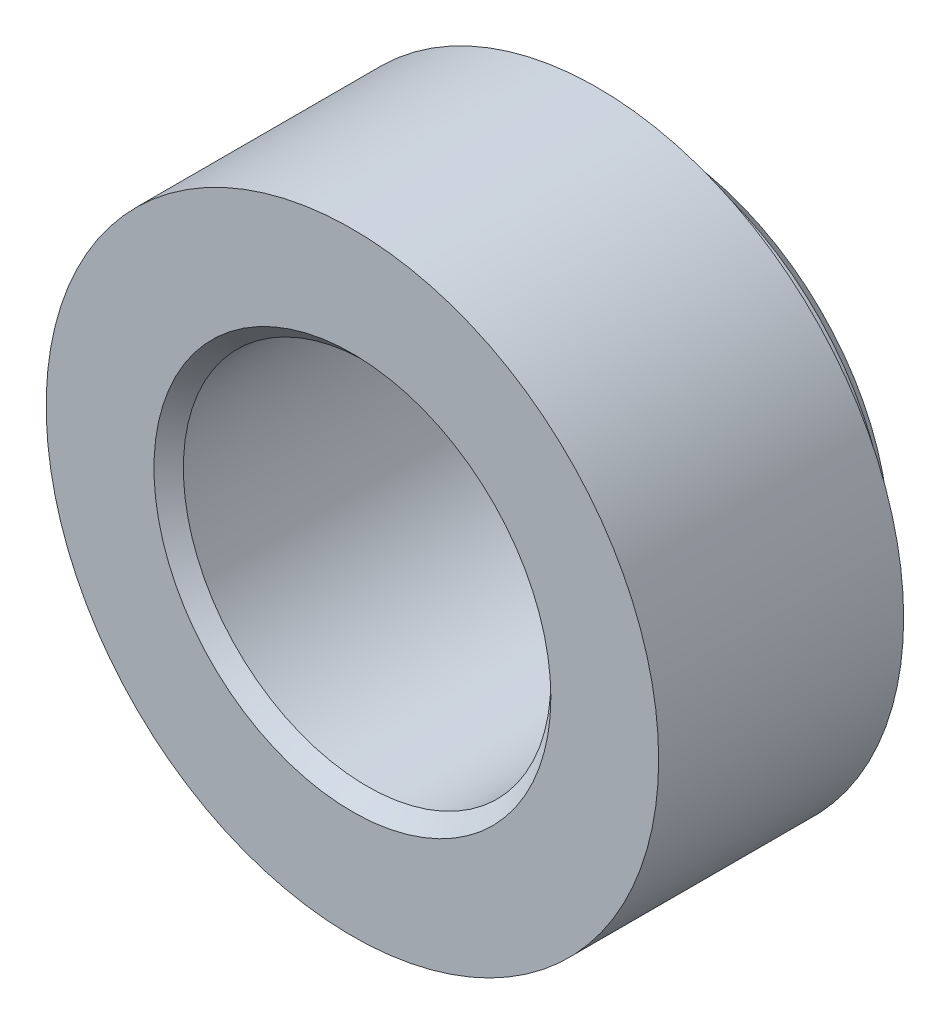
ISO-10303-21;
HEADER;
FILE_DESCRIPTION(('STEP AP214'),'2;1');
FILE_NAME('part.step','',(''),(''),'','','');
FILE_SCHEMA(('AUTOMOTIVE_DESIGN { 1 0 10303 214 1 1 1 1 }'));
ENDSEC;
DATA;
#1=APPLICATION_CONTEXT('core data for automotive mechanical design processes');
#2=APPLICATION_PROTOCOL_DEFINITION('international standard','automotive_design',2000,#1);
#3=PRODUCT_CONTEXT('',#1,'mechanical');
#4=PRODUCT('Part','Part','',(#3));
#5=PRODUCT_RELATED_PRODUCT_CATEGORY('part','',(#4));
#6=PRODUCT_DEFINITION_FORMATION('','',#4);
#7=PRODUCT_DEFINITION_CONTEXT('part definition',#1,'design');
#8=PRODUCT_DEFINITION('design','',#6,#7);
#9=PRODUCT_DEFINITION_SHAPE('','',#8);
#10=(LENGTH_UNIT() NAMED_UNIT(*) SI_UNIT(.MILLI.,.METRE.));
#11=(NAMED_UNIT(*) PLANE_ANGLE_UNIT() SI_UNIT($,.RADIAN.));
#12=(NAMED_UNIT(*) SI_UNIT($,.STERADIAN.) SOLID_ANGLE_UNIT());
#13=UNCERTAINTY_MEASURE_WITH_UNIT(LENGTH_MEASURE(1.E-05),#10,'distance_accuracy_value','');
#14=(GEOMETRIC_REPRESENTATION_CONTEXT(3) GLOBAL_UNCERTAINTY_ASSIGNED_CONTEXT((#13)) GLOBAL_UNIT_ASSIGNED_CONTEXT((#10,
#11,#12)) REPRESENTATION_CONTEXT('',''));
#15=CARTESIAN_POINT('',(0.,0.,0.));
#16=DIRECTION('',(0.,0.,1.));
#17=DIRECTION('',(1.,0.,0.));
#18=AXIS2_PLACEMENT_3D('',#15,#16,#17);
#19=CARTESIAN_POINT('',(0.,0.,0.));
#20=DIRECTION('',(0.,0.,1.));
#21=DIRECTION('',(1.,0.,0.));
#22=AXIS2_PLACEMENT_3D('',#19,#20,#21);
#23=CYLINDRICAL_SURFACE('',#22,31.75);
#24=CARTESIAN_POINT('',(0.,0.,0.));
#25=DIRECTION('',(0.,0.,1.));
#26=DIRECTION('',(1.,0.,0.));
#27=AXIS2_PLACEMENT_3D('',#24,#25,#26);
#28=CIRCLE('',#27,31.75);
#29=CARTESIAN_POINT('',(31.75,0.,0.));
#30=VERTEX_POINT('',#29);
#31=EDGE_CURVE('E10',#30,#30,#28,.T.);
#32=ORIENTED_EDGE('',*,*,#31,.F.);
#33=EDGE_LOOP('',(#32));
#34=FACE_BOUND('',#33,.T.);
#35=CARTESIAN_POINT('',(0.,0.,-25.4));
#36=DIRECTION('',(0.,0.,1.));
#37=DIRECTION('',(1.,0.,0.));
#38=AXIS2_PLACEMENT_3D('',#35,#36,#37);
#39=CIRCLE('',#38,31.75);
#40=CARTESIAN_POINT('',(31.75,0.,-25.4));
#41=VERTEX_POINT('',#40);
#42=EDGE_CURVE('E61',#41,#41,#39,.T.);
#43=ORIENTED_EDGE('',*,*,#42,.T.);
#44=EDGE_LOOP('',(#43));
#45=FACE_BOUND('',#44,.T.);
#46=ADVANCED_FACE('F33',(#34,#45),#23,.T.);
#47=CARTESIAN_POINT('',(0.,31.75,0.));
#48=DIRECTION('',(0.,0.,-1.));
#49=DIRECTION('',(-1.,0.,0.));
#50=AXIS2_PLACEMENT_3D('',#47,#48,#49);
#51=PLANE('',#50);
#52=CARTESIAN_POINT('',(0.,0.,0.));
#53=DIRECTION('',(0.,0.,1.));
#54=DIRECTION('',(1.,0.,0.));
#55=AXIS2_PLACEMENT_3D('',#52,#53,#54);
#56=CIRCLE('',#55,20.574);
#57=CARTESIAN_POINT('',(20.574,0.,0.));
#58=VERTEX_POINT('',#57);
#59=EDGE_CURVE('E39',#58,#58,#56,.T.);
#60=ORIENTED_EDGE('',*,*,#59,.F.);
#61=EDGE_LOOP('',(#60));
#62=FACE_BOUND('',#61,.T.);
#63=ORIENTED_EDGE('',*,*,#31,.T.);
#64=EDGE_LOOP('',(#63));
#65=FACE_BOUND('',#64,.T.);
#66=ADVANCED_FACE('F98',(#62,#65),#51,.F.);
#67=CARTESIAN_POINT('',(0.,0.,0.));
#68=DIRECTION('',(0.,0.,1.));
#69=DIRECTION('',(1.,0.,0.));
#70=AXIS2_PLACEMENT_3D('',#67,#68,#69);
#71=CONICAL_SURFACE('',#70,20.574,0.785398163397446);
#72=CARTESIAN_POINT('',(0.,0.,-1.524));
#73=DIRECTION('',(0.,0.,1.));
#74=DIRECTION('',(1.,0.,0.));
#75=AXIS2_PLACEMENT_3D('',#72,#73,#74);
#76=CIRCLE('',#75,19.05);
#77=CARTESIAN_POINT('',(19.05,0.,-1.524));
#78=VERTEX_POINT('',#77);
#79=EDGE_CURVE('E43',#78,#78,#76,.T.);
#80=ORIENTED_EDGE('',*,*,#79,.F.);
#81=EDGE_LOOP('',(#80));
#82=FACE_BOUND('',#81,.T.);
#83=ORIENTED_EDGE('',*,*,#59,.T.);
#84=EDGE_LOOP('',(#83));
#85=FACE_BOUND('',#84,.T.);
#86=ADVANCED_FACE('F93',(#82,#85),#71,.F.);
#87=CARTESIAN_POINT('',(0.,0.,0.));
#88=DIRECTION('',(0.,0.,1.));
#89=DIRECTION('',(1.,0.,0.));
#90=AXIS2_PLACEMENT_3D('',#87,#88,#89);
#91=CYLINDRICAL_SURFACE('',#90,19.05);
#92=CARTESIAN_POINT('',(0.,0.,-31.75));
#93=DIRECTION('',(0.,0.,1.));
#94=DIRECTION('',(1.,0.,0.));
#95=AXIS2_PLACEMENT_3D('',#92,#93,#94);
#96=CIRCLE('',#95,19.05);
#97=CARTESIAN_POINT('',(19.05,0.,-31.75));
#98=VERTEX_POINT('',#97);
#99=EDGE_CURVE('E47',#98,#98,#96,.T.);
#100=ORIENTED_EDGE('',*,*,#99,.F.);
#101=EDGE_LOOP('',(#100));
#102=FACE_BOUND('',#101,.T.);
#103=ORIENTED_EDGE('',*,*,#79,.T.);
#104=EDGE_LOOP('',(#103));
#105=FACE_BOUND('',#104,.T.);
#106=ADVANCED_FACE('F87',(#102,#105),#91,.F.);
#107=CARTESIAN_POINT('',(0.,19.05,-31.75));
#108=DIRECTION('',(0.,0.,1.));
#109=DIRECTION('',(1.,0.,0.));
#110=AXIS2_PLACEMENT_3D('',#107,#108,#109);
#111=PLANE('',#110);
#112=CARTESIAN_POINT('',(0.,0.,-31.75));
#113=DIRECTION('',(0.,0.,1.));
#114=DIRECTION('',(1.,0.,0.));
#115=AXIS2_PLACEMENT_3D('',#112,#113,#114);
#116=CIRCLE('',#115,23.876);
#117=CARTESIAN_POINT('',(23.876,0.,-31.75));
#118=VERTEX_POINT('',#117);
#119=EDGE_CURVE('E52',#118,#118,#116,.T.);
#120=ORIENTED_EDGE('',*,*,#119,.F.);
#121=EDGE_LOOP('',(#120));
#122=FACE_BOUND('',#121,.T.);
#123=ORIENTED_EDGE('',*,*,#99,.T.);
#124=EDGE_LOOP('',(#123));
#125=FACE_BOUND('',#124,.T.);
#126=ADVANCED_FACE('F81',(#122,#125),#111,.F.);
#127=CARTESIAN_POINT('',(0.,0.,-31.75));
#128=DIRECTION('',(0.,0.,1.));
#129=DIRECTION('',(1.,0.,0.));
#130=AXIS2_PLACEMENT_3D('',#127,#128,#129);
#131=CONICAL_SURFACE('',#130,23.876,0.78539816339745);
#132=CARTESIAN_POINT('',(0.,0.,-30.226));
#133=DIRECTION('',(0.,0.,1.));
#134=DIRECTION('',(1.,0.,0.));
#135=AXIS2_PLACEMENT_3D('',#132,#133,#134);
#136=CIRCLE('',#135,25.4);
#137=CARTESIAN_POINT('',(25.4,0.,-30.226));
#138=VERTEX_POINT('',#137);
#139=EDGE_CURVE('E55',#138,#138,#136,.T.);
#140=ORIENTED_EDGE('',*,*,#139,.F.);
#141=EDGE_LOOP('',(#140));
#142=FACE_BOUND('',#141,.T.);
#143=ORIENTED_EDGE('',*,*,#119,.T.);
#144=EDGE_LOOP('',(#143));
#145=FACE_BOUND('',#144,.T.);
#146=ADVANCED_FACE('F75',(#142,#145),#131,.T.);
#147=CARTESIAN_POINT('',(0.,0.,0.));
#148=DIRECTION('',(0.,0.,1.));
#149=DIRECTION('',(1.,0.,0.));
#150=AXIS2_PLACEMENT_3D('',#147,#148,#149);
#151=CYLINDRICAL_SURFACE('',#150,25.4);
#152=CARTESIAN_POINT('',(0.,0.,-25.4));
#153=DIRECTION('',(0.,0.,1.));
#154=DIRECTION('',(1.,0.,0.));
#155=AXIS2_PLACEMENT_3D('',#152,#153,#154);
#156=CIRCLE('',#155,25.4);
#157=CARTESIAN_POINT('',(25.4,0.,-25.4));
#158=VERTEX_POINT('',#157);
#159=EDGE_CURVE('E58',#158,#158,#156,.T.);
#160=ORIENTED_EDGE('',*,*,#159,.F.);
#161=EDGE_LOOP('',(#160));
#162=FACE_BOUND('',#161,.T.);
#163=ORIENTED_EDGE('',*,*,#139,.T.);
#164=EDGE_LOOP('',(#163));
#165=FACE_BOUND('',#164,.T.);
#166=ADVANCED_FACE('F69',(#162,#165),#151,.T.);
#167=CARTESIAN_POINT('',(0.,25.4,-25.4));
#168=DIRECTION('',(0.,0.,1.));
#169=DIRECTION('',(1.,0.,0.));
#170=AXIS2_PLACEMENT_3D('',#167,#168,#169);
#171=PLANE('',#170);
#172=ORIENTED_EDGE('',*,*,#42,.F.);
#173=EDGE_LOOP('',(#172));
#174=FACE_BOUND('',#173,.T.);
#175=ORIENTED_EDGE('',*,*,#159,.T.);
#176=EDGE_LOOP('',(#175));
#177=FACE_BOUND('',#176,.T.);
#178=ADVANCED_FACE('F66',(#174,#177),#171,.F.);
#179=CLOSED_SHELL('',(#46,#66,#86,#106,#126,#146,#166,#178));
#180=MANIFOLD_SOLID_BREP('B2',#179);
#181=ADVANCED_BREP_SHAPE_REPRESENTATION('',(#18,#180),#14);
#182=SHAPE_DEFINITION_REPRESENTATION(#9,#181);
ENDSEC;
END-ISO-10303-21;
